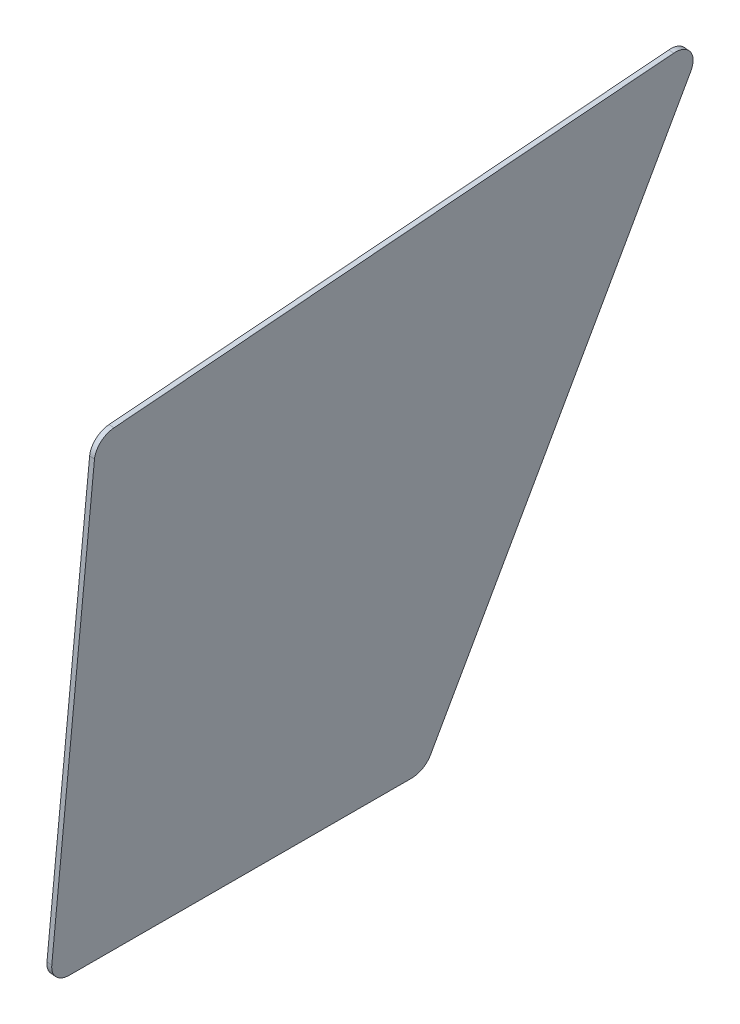
ISO-10303-21;
HEADER;
FILE_DESCRIPTION(('STEP AP214'),'2;1');
FILE_NAME('part.step','',(''),(''),'','','');
FILE_SCHEMA(('AUTOMOTIVE_DESIGN { 1 0 10303 214 1 1 1 1 }'));
ENDSEC;
DATA;
#1=APPLICATION_CONTEXT('core data for automotive mechanical design processes');
#2=APPLICATION_PROTOCOL_DEFINITION('international standard','automotive_design',2000,#1);
#3=PRODUCT_CONTEXT('',#1,'mechanical');
#4=PRODUCT('Part','Part','',(#3));
#5=PRODUCT_RELATED_PRODUCT_CATEGORY('part','',(#4));
#6=PRODUCT_DEFINITION_FORMATION('','',#4);
#7=PRODUCT_DEFINITION_CONTEXT('part definition',#1,'design');
#8=PRODUCT_DEFINITION('design','',#6,#7);
#9=PRODUCT_DEFINITION_SHAPE('','',#8);
#10=(LENGTH_UNIT() NAMED_UNIT(*) SI_UNIT(.MILLI.,.METRE.));
#11=(NAMED_UNIT(*) PLANE_ANGLE_UNIT() SI_UNIT($,.RADIAN.));
#12=(NAMED_UNIT(*) SI_UNIT($,.STERADIAN.) SOLID_ANGLE_UNIT());
#13=UNCERTAINTY_MEASURE_WITH_UNIT(LENGTH_MEASURE(1.E-05),#10,'distance_accuracy_value','');
#14=(GEOMETRIC_REPRESENTATION_CONTEXT(3) GLOBAL_UNCERTAINTY_ASSIGNED_CONTEXT((#13)) GLOBAL_UNIT_ASSIGNED_CONTEXT((#10,
#11,#12)) REPRESENTATION_CONTEXT('',''));
#15=CARTESIAN_POINT('',(0.,0.,0.));
#16=DIRECTION('',(0.,0.,1.));
#17=DIRECTION('',(1.,0.,0.));
#18=AXIS2_PLACEMENT_3D('',#15,#16,#17);
#19=CARTESIAN_POINT('',(173.751852829846,468.710075719023,948.211534765408));
#20=DIRECTION('',(0.0355746236654687,0.382865571766707,0.923118843977747));
#21=DIRECTION('',(0.,-0.923703527300497,0.383108070461352));
#22=AXIS2_PLACEMENT_3D('',#19,#20,#21);
#23=PLANE('',#22);
#24=DIRECTION('',(0.0854053185316787,0.919159579003187,-0.384514759005669));
#25=VECTOR('',#24,1.);
#26=CARTESIAN_POINT('',(173.751852829846,468.710075719023,948.211534765408));
#27=LINE('',#26,#25);
#28=CARTESIAN_POINT('',(140.992484648146,116.143191314362,1095.70188756928));
#29=VERTEX_POINT('',#28);
#30=CARTESIAN_POINT('',(171.957515725346,449.398841173957,956.290060917799));
#31=VERTEX_POINT('',#30);
#32=EDGE_CURVE('E125',#29,#31,#27,.T.);
#33=ORIENTED_EDGE('',*,*,#32,.F.);
#34=DIRECTION('',(-0.995710991059938,0.0925182267579596,0.));
#35=VECTOR('',#34,1.);
#36=CARTESIAN_POINT('',(140.992484648146,116.143191314362,1095.70188756928));
#37=LINE('',#36,#35);
#38=CARTESIAN_POINT('',(137.83110225153,116.436936684319,1095.70188756928));
#39=VERTEX_POINT('',#38);
#40=EDGE_CURVE('E110',#29,#39,#37,.T.);
#41=ORIENTED_EDGE('',*,*,#40,.T.);
#42=DIRECTION('',(0.0854053185316787,0.919159579003187,-0.384514759005669));
#43=VECTOR('',#42,1.);
#44=CARTESIAN_POINT('',(170.59047043323,469.00382108898,948.211534765408));
#45=LINE('',#44,#43);
#46=CARTESIAN_POINT('',(168.796133328731,449.692586543913,956.290060917799));
#47=VERTEX_POINT('',#46);
#48=EDGE_CURVE('E122',#39,#47,#45,.T.);
#49=ORIENTED_EDGE('',*,*,#48,.T.);
#50=DIRECTION('',(-0.995710991059938,0.0925182267579596,0.));
#51=VECTOR('',#50,1.);
#52=CARTESIAN_POINT('',(171.957515725346,449.398841173957,956.290060917799));
#53=LINE('',#52,#51);
#54=EDGE_CURVE('E127',#47,#31,#53,.F.);
#55=ORIENTED_EDGE('',*,*,#54,.T.);
#56=EDGE_LOOP('',(#33,#41,#49,#55));
#57=FACE_BOUND('',#56,.T.);
#58=ADVANCED_FACE('F39',(#57),#23,.F.);
#59=CARTESIAN_POINT('',(170.495183084166,433.660745725826,1344.0413217181));
#60=DIRECTION('',(-0.0921545574648567,-0.991797064853797,-0.0885783251470098));
#61=DIRECTION('',(0.995710991059938,-0.0925182267579596,0.));
#62=AXIS2_PLACEMENT_3D('',#59,#60,#61);
#63=PLANE('',#62);
#64=DIRECTION('',(-0.00819510957179128,-0.0881984119185585,0.996069214620224));
#65=VECTOR('',#64,1.);
#66=CARTESIAN_POINT('',(170.495183084166,433.660745725826,1344.0413217181));
#67=LINE('',#66,#65);
#68=CARTESIAN_POINT('',(173.579676325701,466.857056659037,969.138614965683));
#69=VERTEX_POINT('',#68);
#70=CARTESIAN_POINT('',(170.59041627163,434.6856759995,1332.46626644747));
#71=VERTEX_POINT('',#70);
#72=EDGE_CURVE('E165',#69,#71,#67,.T.);
#73=ORIENTED_EDGE('',*,*,#72,.F.);
#74=DIRECTION('',(-0.995710991059937,0.0925182267579596,0.));
#75=VECTOR('',#74,1.);
#76=CARTESIAN_POINT('',(173.579676325701,466.857056659037,969.138614965683));
#77=LINE('',#76,#75);
#78=CARTESIAN_POINT('',(170.418293929086,467.150802028994,969.138614965683));
#79=VERTEX_POINT('',#78);
#80=EDGE_CURVE('E11',#69,#79,#77,.T.);
#81=ORIENTED_EDGE('',*,*,#80,.T.);
#82=DIRECTION('',(-0.00819510957179128,-0.0881984119185585,0.996069214620224));
#83=VECTOR('',#82,1.);
#84=CARTESIAN_POINT('',(167.333800687551,433.954491095782,1344.0413217181));
#85=LINE('',#84,#83);
#86=CARTESIAN_POINT('',(167.429033875014,434.979421369457,1332.46626644747));
#87=VERTEX_POINT('',#86);
#88=EDGE_CURVE('E132',#79,#87,#85,.T.);
#89=ORIENTED_EDGE('',*,*,#88,.T.);
#90=DIRECTION('',(-0.995710991059938,0.0925182267579596,0.));
#91=VECTOR('',#90,1.);
#92=CARTESIAN_POINT('',(170.59041627163,434.6856759995,1332.46626644747));
#93=LINE('',#92,#91);
#94=EDGE_CURVE('E47',#87,#71,#93,.F.);
#95=ORIENTED_EDGE('',*,*,#94,.T.);
#96=EDGE_LOOP('',(#73,#81,#89,#95));
#97=FACE_BOUND('',#96,.T.);
#98=ADVANCED_FACE('F164',(#97),#63,.F.);
#99=CARTESIAN_POINT('',(140.305645528048,108.751207216351,1344.0413217181));
#100=DIRECTION('',(0.,0.,-1.));
#101=DIRECTION('',(-1.,0.,0.));
#102=AXIS2_PLACEMENT_3D('',#99,#100,#101);
#103=PLANE('',#102);
#104=DIRECTION('',(-0.0925182267579596,-0.995710991059937,0.));
#105=VECTOR('',#104,1.);
#106=CARTESIAN_POINT('',(137.144263131433,109.044952586308,1344.0413217181));
#107=LINE('',#106,#105);
#108=CARTESIAN_POINT('',(166.258670995211,422.383598645814,1344.0413217181));
#109=VERTEX_POINT('',#108);
#110=CARTESIAN_POINT('',(138.317295399753,121.669504129968,1344.0413217181));
#111=VERTEX_POINT('',#110);
#112=EDGE_CURVE('E135',#109,#111,#107,.T.);
#113=ORIENTED_EDGE('',*,*,#112,.T.);
#114=DIRECTION('',(-0.995710991059938,0.0925182267579596,0.));
#115=VECTOR('',#114,1.);
#116=CARTESIAN_POINT('',(141.478677796368,121.375758760011,1344.0413217181));
#117=LINE('',#116,#115);
#118=CARTESIAN_POINT('',(141.478677796368,121.375758760011,1344.0413217181));
#119=VERTEX_POINT('',#118);
#120=EDGE_CURVE('E54',#111,#119,#117,.F.);
#121=ORIENTED_EDGE('',*,*,#120,.T.);
#122=DIRECTION('',(-0.0925182267579596,-0.995710991059937,0.));
#123=VECTOR('',#122,1.);
#124=CARTESIAN_POINT('',(140.305645528048,108.751207216351,1344.0413217181));
#125=LINE('',#124,#123);
#126=CARTESIAN_POINT('',(169.420053391826,422.089853275857,1344.0413217181));
#127=VERTEX_POINT('',#126);
#128=EDGE_CURVE('E171',#127,#119,#125,.T.);
#129=ORIENTED_EDGE('',*,*,#128,.F.);
#130=DIRECTION('',(-0.995710991059937,0.0925182267579596,0.));
#131=VECTOR('',#130,1.);
#132=CARTESIAN_POINT('',(169.420053391826,422.089853275857,1344.0413217181));
#133=LINE('',#132,#131);
#134=EDGE_CURVE('E158',#127,#109,#133,.T.);
#135=ORIENTED_EDGE('',*,*,#134,.T.);
#136=EDGE_LOOP('',(#113,#121,#129,#135));
#137=FACE_BOUND('',#136,.T.);
#138=ADVANCED_FACE('F175',(#137),#103,.F.);
#139=CARTESIAN_POINT('',(140.267999461838,108.346048111933,1098.96368966317));
#140=DIRECTION('',(0.0925180992393236,0.995709618663256,-0.00166030557924145));
#141=DIRECTION('',(-0.995710991059937,0.0925182267579596,0.));
#142=AXIS2_PLACEMENT_3D('',#139,#140,#141);
#143=PLANE('',#142);
#144=DIRECTION('',(-0.000153608528067779,-0.00165318451376885,-0.999998621691742));
#145=VECTOR('',#144,1.);
#146=CARTESIAN_POINT('',(137.106617065223,108.639793481889,1098.96368966317));
#147=LINE('',#146,#145);
#148=CARTESIAN_POINT('',(137.142315539413,109.023991972944,1331.36240759896));
#149=VERTEX_POINT('',#148);
#150=CARTESIAN_POINT('',(137.107920111742,108.653817288732,1107.44658276865));
#151=VERTEX_POINT('',#150);
#152=EDGE_CURVE('E142',#149,#151,#147,.T.);
#153=ORIENTED_EDGE('',*,*,#152,.T.);
#154=DIRECTION('',(-0.995710991059937,0.0925182267579596,0.));
#155=VECTOR('',#154,1.);
#156=CARTESIAN_POINT('',(140.269302508358,108.360071918776,1107.44658276865));
#157=LINE('',#156,#155);
#158=CARTESIAN_POINT('',(140.269302508358,108.360071918776,1107.44658276865));
#159=VERTEX_POINT('',#158);
#160=EDGE_CURVE('E111',#151,#159,#157,.F.);
#161=ORIENTED_EDGE('',*,*,#160,.T.);
#162=DIRECTION('',(-0.000153608528067779,-0.00165318451376885,-0.999998621691742));
#163=VECTOR('',#162,1.);
#164=CARTESIAN_POINT('',(140.267999461838,108.346048111933,1098.96368966317));
#165=LINE('',#164,#163);
#166=CARTESIAN_POINT('',(140.303697936029,108.730246602988,1331.36240759896));
#167=VERTEX_POINT('',#166);
#168=EDGE_CURVE('E138',#167,#159,#165,.T.);
#169=ORIENTED_EDGE('',*,*,#168,.F.);
#170=DIRECTION('',(-0.995710991059937,0.0925182267579596,0.));
#171=VECTOR('',#170,1.);
#172=CARTESIAN_POINT('',(140.303697936029,108.730246602988,1331.36240759896));
#173=LINE('',#172,#171);
#174=EDGE_CURVE('E116',#167,#149,#173,.T.);
#175=ORIENTED_EDGE('',*,*,#174,.T.);
#176=EDGE_LOOP('',(#153,#161,#169,#175));
#177=FACE_BOUND('',#176,.T.);
#178=ADVANCED_FACE('F182',(#177),#143,.F.);
#179=CARTESIAN_POINT('',(129.086367078636,-11.9942853779582,0.));
#180=DIRECTION('',(-0.995710991059937,0.0925182267579596,0.));
#181=DIRECTION('',(-0.0925182267579596,-0.995710991059938,0.));
#182=AXIS2_PLACEMENT_3D('',#179,#180,#181);
#183=PLANE('',#182);
#184=ORIENTED_EDGE('',*,*,#168,.T.);
#185=CARTESIAN_POINT('',(141.444282368697,121.005584075799,1107.4254968878));
#186=DIRECTION('',(-0.995710991059937,0.0925182267579596,0.));
#187=DIRECTION('',(-0.0925182267579596,-0.995710991059938,0.));
#188=AXIS2_PLACEMENT_3D('',#185,#186,#187);
#189=CIRCLE('',#188,12.7);
#190=EDGE_CURVE('E156',#159,#29,#189,.F.);
#191=ORIENTED_EDGE('',*,*,#190,.T.);
#192=ORIENTED_EDGE('',*,*,#32,.T.);
#193=CARTESIAN_POINT('',(172.409313445898,454.261233935394,968.013670236316));
#194=DIRECTION('',(-0.995710991059937,0.0925182267579596,0.));
#195=DIRECTION('',(-0.0925182267579596,-0.995710991059938,0.));
#196=AXIS2_PLACEMENT_3D('',#193,#194,#195);
#197=CIRCLE('',#196,12.7);
#198=EDGE_CURVE('E152',#31,#69,#197,.F.);
#199=ORIENTED_EDGE('',*,*,#198,.T.);
#200=ORIENTED_EDGE('',*,*,#72,.T.);
#201=CARTESIAN_POINT('',(169.420053391826,422.089853275857,1331.3413217181));
#202=DIRECTION('',(-0.995710991059937,0.0925182267579596,0.));
#203=DIRECTION('',(-0.0925182267579596,-0.995710991059938,0.));
#204=AXIS2_PLACEMENT_3D('',#201,#202,#203);
#205=CIRCLE('',#204,12.7);
#206=EDGE_CURVE('E61',#71,#127,#205,.F.);
#207=ORIENTED_EDGE('',*,*,#206,.T.);
#208=ORIENTED_EDGE('',*,*,#128,.T.);
#209=CARTESIAN_POINT('',(141.478677796368,121.375758760011,1331.3413217181));
#210=DIRECTION('',(-0.995710991059937,0.0925182267579596,0.));
#211=DIRECTION('',(-0.0925182267579596,-0.995710991059938,0.));
#212=AXIS2_PLACEMENT_3D('',#209,#210,#211);
#213=CIRCLE('',#212,12.7);
#214=EDGE_CURVE('E154',#119,#167,#213,.F.);
#215=ORIENTED_EDGE('',*,*,#214,.T.);
#216=EDGE_LOOP('',(#184,#191,#192,#199,#200,#207,#208,#215));
#217=FACE_BOUND('',#216,.T.);
#218=ADVANCED_FACE('F169',(#217),#183,.F.);
#219=CARTESIAN_POINT('',(125.92498468202,-11.7005400080016,0.));
#220=DIRECTION('',(-0.995710991059937,0.0925182267579596,0.));
#221=DIRECTION('',(-0.0925182267579596,-0.995710991059938,0.));
#222=AXIS2_PLACEMENT_3D('',#219,#220,#221);
#223=PLANE('',#222);
#224=ORIENTED_EDGE('',*,*,#48,.F.);
#225=CARTESIAN_POINT('',(138.282899972082,121.299329445756,1107.4254968878));
#226=DIRECTION('',(-0.995710991059937,0.0925182267579596,0.));
#227=DIRECTION('',(-0.0925182267579596,-0.995710991059938,0.));
#228=AXIS2_PLACEMENT_3D('',#225,#226,#227);
#229=CIRCLE('',#228,12.7);
#230=EDGE_CURVE('E106',#39,#151,#229,.T.);
#231=ORIENTED_EDGE('',*,*,#230,.T.);
#232=ORIENTED_EDGE('',*,*,#152,.F.);
#233=CARTESIAN_POINT('',(138.317295399753,121.669504129968,1331.3413217181));
#234=DIRECTION('',(-0.995710991059937,0.0925182267579596,0.));
#235=DIRECTION('',(-0.0925182267579596,-0.995710991059938,0.));
#236=AXIS2_PLACEMENT_3D('',#233,#234,#235);
#237=CIRCLE('',#236,12.7);
#238=EDGE_CURVE('E117',#149,#111,#237,.T.);
#239=ORIENTED_EDGE('',*,*,#238,.T.);
#240=ORIENTED_EDGE('',*,*,#112,.F.);
#241=CARTESIAN_POINT('',(166.258670995211,422.383598645814,1331.3413217181));
#242=DIRECTION('',(-0.995710991059937,0.0925182267579596,0.));
#243=DIRECTION('',(-0.0925182267579596,-0.995710991059938,0.));
#244=AXIS2_PLACEMENT_3D('',#241,#242,#243);
#245=CIRCLE('',#244,12.7);
#246=EDGE_CURVE('E126',#109,#87,#245,.T.);
#247=ORIENTED_EDGE('',*,*,#246,.T.);
#248=ORIENTED_EDGE('',*,*,#88,.F.);
#249=CARTESIAN_POINT('',(169.247931049282,454.55497930535,968.013670236316));
#250=DIRECTION('',(-0.995710991059937,0.0925182267579596,0.));
#251=DIRECTION('',(-0.0925182267579596,-0.995710991059938,0.));
#252=AXIS2_PLACEMENT_3D('',#249,#250,#251);
#253=CIRCLE('',#252,12.7);
#254=EDGE_CURVE('E131',#79,#47,#253,.T.);
#255=ORIENTED_EDGE('',*,*,#254,.T.);
#256=EDGE_LOOP('',(#224,#231,#232,#239,#240,#247,#248,#255));
#257=FACE_BOUND('',#256,.T.);
#258=ADVANCED_FACE('F129',(#257),#223,.T.);
#259=CARTESIAN_POINT('',(141.444282368697,121.005584075799,1107.4254968878));
#260=DIRECTION('',(-0.995710991059937,0.0925182267579596,0.));
#261=DIRECTION('',(-0.0925182267579596,-0.995710991059938,0.));
#262=AXIS2_PLACEMENT_3D('',#259,#260,#261);
#263=CYLINDRICAL_SURFACE('',#262,12.7);
#264=ORIENTED_EDGE('',*,*,#190,.F.);
#265=ORIENTED_EDGE('',*,*,#160,.F.);
#266=ORIENTED_EDGE('',*,*,#230,.F.);
#267=ORIENTED_EDGE('',*,*,#40,.F.);
#268=EDGE_LOOP('',(#264,#265,#266,#267));
#269=FACE_BOUND('',#268,.T.);
#270=ADVANCED_FACE('F109',(#269),#263,.T.);
#271=CARTESIAN_POINT('',(141.478677796368,121.375758760011,1331.3413217181));
#272=DIRECTION('',(-0.995710991059938,0.0925182267579596,0.));
#273=DIRECTION('',(-0.0925182267579596,-0.995710991059938,0.));
#274=AXIS2_PLACEMENT_3D('',#271,#272,#273);
#275=CYLINDRICAL_SURFACE('',#274,12.7);
#276=ORIENTED_EDGE('',*,*,#214,.F.);
#277=ORIENTED_EDGE('',*,*,#120,.F.);
#278=ORIENTED_EDGE('',*,*,#238,.F.);
#279=ORIENTED_EDGE('',*,*,#174,.F.);
#280=EDGE_LOOP('',(#276,#277,#278,#279));
#281=FACE_BOUND('',#280,.T.);
#282=ADVANCED_FACE('F179',(#281),#275,.T.);
#283=CARTESIAN_POINT('',(172.409313445898,454.261233935394,968.013670236316));
#284=DIRECTION('',(-0.995710991059938,0.0925182267579596,0.));
#285=DIRECTION('',(-0.0925182267579596,-0.995710991059938,0.));
#286=AXIS2_PLACEMENT_3D('',#283,#284,#285);
#287=CYLINDRICAL_SURFACE('',#286,12.7);
#288=ORIENTED_EDGE('',*,*,#198,.F.);
#289=ORIENTED_EDGE('',*,*,#54,.F.);
#290=ORIENTED_EDGE('',*,*,#254,.F.);
#291=ORIENTED_EDGE('',*,*,#80,.F.);
#292=EDGE_LOOP('',(#288,#289,#290,#291));
#293=FACE_BOUND('',#292,.T.);
#294=ADVANCED_FACE('F185',(#293),#287,.T.);
#295=CARTESIAN_POINT('',(169.420053391826,422.089853275857,1331.3413217181));
#296=DIRECTION('',(-0.995710991059937,0.0925182267579596,0.));
#297=DIRECTION('',(-0.0925182267579596,-0.995710991059937,0.));
#298=AXIS2_PLACEMENT_3D('',#295,#296,#297);
#299=CYLINDRICAL_SURFACE('',#298,12.7);
#300=ORIENTED_EDGE('',*,*,#206,.F.);
#301=ORIENTED_EDGE('',*,*,#94,.F.);
#302=ORIENTED_EDGE('',*,*,#246,.F.);
#303=ORIENTED_EDGE('',*,*,#134,.F.);
#304=EDGE_LOOP('',(#300,#301,#302,#303));
#305=FACE_BOUND('',#304,.T.);
#306=ADVANCED_FACE('F41',(#305),#299,.T.);
#307=CLOSED_SHELL('',(#58,#98,#138,#178,#218,#258,#270,#282,#294,#306));
#308=MANIFOLD_SOLID_BREP('B2',#307);
#309=ADVANCED_BREP_SHAPE_REPRESENTATION('',(#18,#308),#14);
#310=SHAPE_DEFINITION_REPRESENTATION(#9,#309);
ENDSEC;
END-ISO-10303-21;
